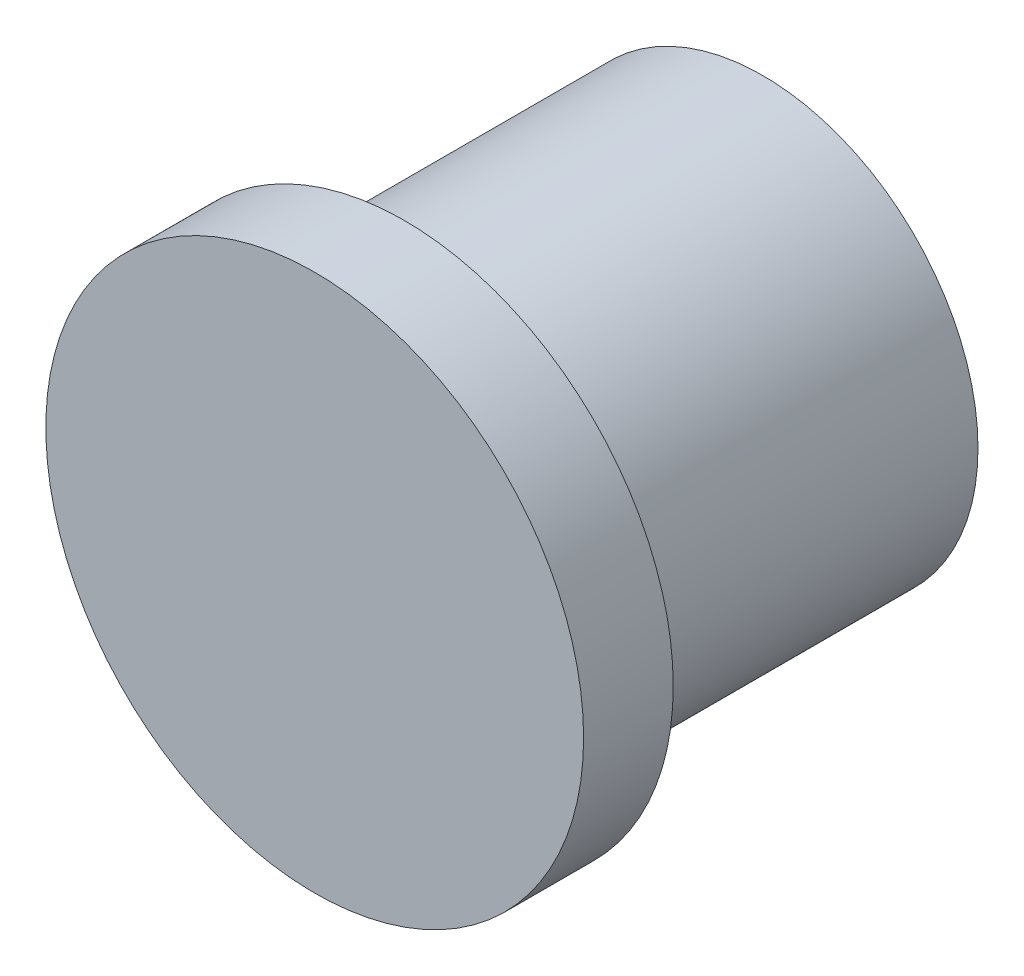
ISO-10303-21;
HEADER;
FILE_DESCRIPTION(('STEP AP214'),'2;1');
FILE_NAME('part.step','',(''),(''),'','','');
FILE_SCHEMA(('AUTOMOTIVE_DESIGN { 1 0 10303 214 1 1 1 1 }'));
ENDSEC;
DATA;
#1=APPLICATION_CONTEXT('core data for automotive mechanical design processes');
#2=APPLICATION_PROTOCOL_DEFINITION('international standard','automotive_design',2000,#1);
#3=PRODUCT_CONTEXT('',#1,'mechanical');
#4=PRODUCT('Part','Part','',(#3));
#5=PRODUCT_RELATED_PRODUCT_CATEGORY('part','',(#4));
#6=PRODUCT_DEFINITION_FORMATION('','',#4);
#7=PRODUCT_DEFINITION_CONTEXT('part definition',#1,'design');
#8=PRODUCT_DEFINITION('design','',#6,#7);
#9=PRODUCT_DEFINITION_SHAPE('','',#8);
#10=(LENGTH_UNIT() NAMED_UNIT(*) SI_UNIT(.MILLI.,.METRE.));
#11=(NAMED_UNIT(*) PLANE_ANGLE_UNIT() SI_UNIT($,.RADIAN.));
#12=(NAMED_UNIT(*) SI_UNIT($,.STERADIAN.) SOLID_ANGLE_UNIT());
#13=UNCERTAINTY_MEASURE_WITH_UNIT(LENGTH_MEASURE(1.E-05),#10,'distance_accuracy_value','');
#14=(GEOMETRIC_REPRESENTATION_CONTEXT(3) GLOBAL_UNCERTAINTY_ASSIGNED_CONTEXT((#13)) GLOBAL_UNIT_ASSIGNED_CONTEXT((#10,
#11,#12)) REPRESENTATION_CONTEXT('',''));
#15=CARTESIAN_POINT('',(0.,0.,0.));
#16=DIRECTION('',(0.,0.,1.));
#17=DIRECTION('',(1.,0.,0.));
#18=AXIS2_PLACEMENT_3D('',#15,#16,#17);
#19=CARTESIAN_POINT('',(0.,0.,5.));
#20=DIRECTION('',(0.,0.,1.));
#21=DIRECTION('',(1.,0.,0.));
#22=AXIS2_PLACEMENT_3D('',#19,#20,#21);
#23=PLANE('',#22);
#24=CARTESIAN_POINT('',(0.,0.,5.));
#25=DIRECTION('',(0.,0.,1.));
#26=DIRECTION('',(1.,0.,0.));
#27=AXIS2_PLACEMENT_3D('',#24,#25,#26);
#28=CIRCLE('',#27,15.);
#29=CARTESIAN_POINT('',(15.,0.,5.));
#30=VERTEX_POINT('',#29);
#31=EDGE_CURVE('E10',#30,#30,#28,.T.);
#32=ORIENTED_EDGE('',*,*,#31,.T.);
#33=EDGE_LOOP('',(#32));
#34=FACE_BOUND('',#33,.T.);
#35=ADVANCED_FACE('F41',(#34),#23,.T.);
#36=CARTESIAN_POINT('',(0.,0.,0.));
#37=DIRECTION('',(0.,0.,1.));
#38=DIRECTION('',(1.,0.,0.));
#39=AXIS2_PLACEMENT_3D('',#36,#37,#38);
#40=PLANE('',#39);
#41=CARTESIAN_POINT('',(0.,0.,0.));
#42=DIRECTION('',(0.,0.,1.));
#43=DIRECTION('',(1.,0.,0.));
#44=AXIS2_PLACEMENT_3D('',#41,#42,#43);
#45=CIRCLE('',#44,15.);
#46=CARTESIAN_POINT('',(15.,0.,0.));
#47=VERTEX_POINT('',#46);
#48=EDGE_CURVE('E45',#47,#47,#45,.T.);
#49=ORIENTED_EDGE('',*,*,#48,.F.);
#50=EDGE_LOOP('',(#49));
#51=FACE_BOUND('',#50,.T.);
#52=CARTESIAN_POINT('',(0.,0.,0.));
#53=DIRECTION('',(0.,0.,1.));
#54=DIRECTION('',(1.,0.,0.));
#55=AXIS2_PLACEMENT_3D('',#52,#53,#54);
#56=CIRCLE('',#55,12.);
#57=CARTESIAN_POINT('',(12.,0.,0.));
#58=VERTEX_POINT('',#57);
#59=EDGE_CURVE('E54',#58,#58,#56,.T.);
#60=ORIENTED_EDGE('',*,*,#59,.T.);
#61=EDGE_LOOP('',(#60));
#62=FACE_BOUND('',#61,.T.);
#63=ADVANCED_FACE('F75',(#51,#62),#40,.F.);
#64=CARTESIAN_POINT('',(0.,0.,5.));
#65=DIRECTION('',(0.,0.,-1.));
#66=DIRECTION('',(-1.,0.,0.));
#67=AXIS2_PLACEMENT_3D('',#64,#65,#66);
#68=CYLINDRICAL_SURFACE('',#67,15.);
#69=ORIENTED_EDGE('',*,*,#31,.F.);
#70=EDGE_LOOP('',(#69));
#71=FACE_BOUND('',#70,.T.);
#72=ORIENTED_EDGE('',*,*,#48,.T.);
#73=EDGE_LOOP('',(#72));
#74=FACE_BOUND('',#73,.T.);
#75=ADVANCED_FACE('F43',(#71,#74),#68,.T.);
#76=CARTESIAN_POINT('',(0.,0.,-20.));
#77=DIRECTION('',(0.,0.,1.));
#78=DIRECTION('',(1.,0.,0.));
#79=AXIS2_PLACEMENT_3D('',#76,#77,#78);
#80=CYLINDRICAL_SURFACE('',#79,12.);
#81=CARTESIAN_POINT('',(0.,0.,-20.));
#82=DIRECTION('',(0.,0.,1.));
#83=DIRECTION('',(1.,0.,0.));
#84=AXIS2_PLACEMENT_3D('',#81,#82,#83);
#85=CIRCLE('',#84,12.);
#86=CARTESIAN_POINT('',(12.,0.,-20.));
#87=VERTEX_POINT('',#86);
#88=EDGE_CURVE('E59',#87,#87,#85,.T.);
#89=ORIENTED_EDGE('',*,*,#88,.T.);
#90=EDGE_LOOP('',(#89));
#91=FACE_BOUND('',#90,.T.);
#92=ORIENTED_EDGE('',*,*,#59,.F.);
#93=EDGE_LOOP('',(#92));
#94=FACE_BOUND('',#93,.T.);
#95=ADVANCED_FACE('F64',(#91,#94),#80,.T.);
#96=CARTESIAN_POINT('',(0.,0.,-20.));
#97=DIRECTION('',(0.,0.,1.));
#98=DIRECTION('',(1.,0.,0.));
#99=AXIS2_PLACEMENT_3D('',#96,#97,#98);
#100=PLANE('',#99);
#101=ORIENTED_EDGE('',*,*,#88,.F.);
#102=EDGE_LOOP('',(#101));
#103=FACE_BOUND('',#102,.T.);
#104=ADVANCED_FACE('F67',(#103),#100,.F.);
#105=CLOSED_SHELL('',(#35,#63,#75,#95,#104));
#106=MANIFOLD_SOLID_BREP('B2',#105);
#107=ADVANCED_BREP_SHAPE_REPRESENTATION('',(#18,#106),#14);
#108=SHAPE_DEFINITION_REPRESENTATION(#9,#107);
ENDSEC;
END-ISO-10303-21;
